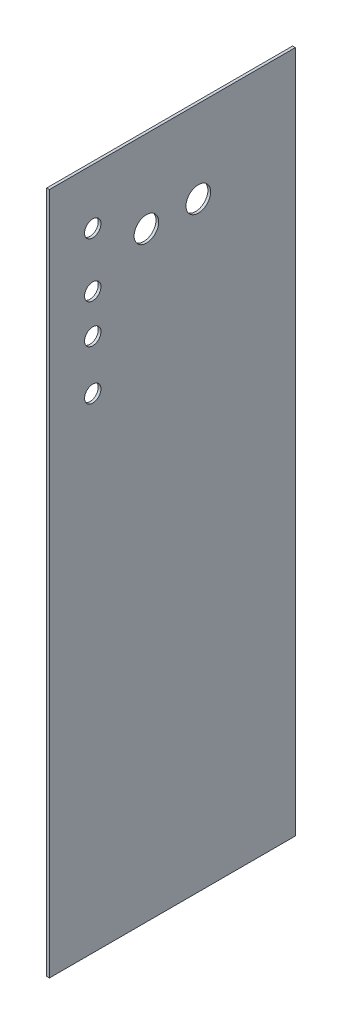
ISO-10303-21;
HEADER;
FILE_DESCRIPTION(('STEP AP214'),'2;1');
FILE_NAME('part.step','',(''),(''),'','','');
FILE_SCHEMA(('AUTOMOTIVE_DESIGN { 1 0 10303 214 1 1 1 1 }'));
ENDSEC;
DATA;
#1=APPLICATION_CONTEXT('core data for automotive mechanical design processes');
#2=APPLICATION_PROTOCOL_DEFINITION('international standard','automotive_design',2000,#1);
#3=PRODUCT_CONTEXT('',#1,'mechanical');
#4=PRODUCT('Part','Part','',(#3));
#5=PRODUCT_RELATED_PRODUCT_CATEGORY('part','',(#4));
#6=PRODUCT_DEFINITION_FORMATION('','',#4);
#7=PRODUCT_DEFINITION_CONTEXT('part definition',#1,'design');
#8=PRODUCT_DEFINITION('design','',#6,#7);
#9=PRODUCT_DEFINITION_SHAPE('','',#8);
#10=(LENGTH_UNIT() NAMED_UNIT(*) SI_UNIT(.MILLI.,.METRE.));
#11=(NAMED_UNIT(*) PLANE_ANGLE_UNIT() SI_UNIT($,.RADIAN.));
#12=(NAMED_UNIT(*) SI_UNIT($,.STERADIAN.) SOLID_ANGLE_UNIT());
#13=UNCERTAINTY_MEASURE_WITH_UNIT(LENGTH_MEASURE(1.E-05),#10,'distance_accuracy_value','');
#14=(GEOMETRIC_REPRESENTATION_CONTEXT(3) GLOBAL_UNCERTAINTY_ASSIGNED_CONTEXT((#13)) GLOBAL_UNIT_ASSIGNED_CONTEXT((#10,
#11,#12)) REPRESENTATION_CONTEXT('',''));
#15=CARTESIAN_POINT('',(0.,0.,0.));
#16=DIRECTION('',(0.,0.,1.));
#17=DIRECTION('',(1.,0.,0.));
#18=AXIS2_PLACEMENT_3D('',#15,#16,#17);
#19=CARTESIAN_POINT('',(-248.,250.,-133.832293437024));
#20=DIRECTION('',(1.,0.,0.));
#21=DIRECTION('',(0.,0.,-1.));
#22=AXIS2_PLACEMENT_3D('',#19,#20,#21);
#23=PLANE('',#22);
#24=DIRECTION('',(0.,0.,1.));
#25=VECTOR('',#24,1.);
#26=CARTESIAN_POINT('',(-248.,-250.,0.));
#27=LINE('',#26,#25);
#28=CARTESIAN_POINT('',(-248.,-250.,-90.));
#29=VERTEX_POINT('',#28);
#30=CARTESIAN_POINT('',(-248.,-250.,90.));
#31=VERTEX_POINT('',#30);
#32=EDGE_CURVE('E38',#29,#31,#27,.T.);
#33=ORIENTED_EDGE('',*,*,#32,.F.);
#34=DIRECTION('',(0.,1.,0.));
#35=VECTOR('',#34,1.);
#36=CARTESIAN_POINT('',(-248.,250.,-90.));
#37=LINE('',#36,#35);
#38=CARTESIAN_POINT('',(-248.,250.,-90.));
#39=VERTEX_POINT('',#38);
#40=EDGE_CURVE('E82',#29,#39,#37,.T.);
#41=ORIENTED_EDGE('',*,*,#40,.T.);
#42=DIRECTION('',(0.,0.,1.));
#43=VECTOR('',#42,1.);
#44=CARTESIAN_POINT('',(-248.,250.,0.));
#45=LINE('',#44,#43);
#46=CARTESIAN_POINT('',(-248.,250.,90.));
#47=VERTEX_POINT('',#46);
#48=EDGE_CURVE('E90',#39,#47,#45,.T.);
#49=ORIENTED_EDGE('',*,*,#48,.T.);
#50=DIRECTION('',(0.,-1.,0.));
#51=VECTOR('',#50,1.);
#52=CARTESIAN_POINT('',(-248.,250.,90.));
#53=LINE('',#52,#51);
#54=EDGE_CURVE('E91',#47,#31,#53,.T.);
#55=ORIENTED_EDGE('',*,*,#54,.T.);
#56=EDGE_LOOP('',(#33,#41,#49,#55));
#57=FACE_BOUND('',#56,.T.);
#58=CARTESIAN_POINT('',(-248.,104.725874497319,58.2924610892519));
#59=DIRECTION('',(-1.,0.,0.));
#60=DIRECTION('',(0.,0.,1.));
#61=AXIS2_PLACEMENT_3D('',#58,#59,#60);
#62=CIRCLE('',#61,6.);
#63=CARTESIAN_POINT('',(-248.,104.725874497319,64.2924610892519));
#64=VERTEX_POINT('',#63);
#65=EDGE_CURVE('E44',#64,#64,#62,.T.);
#66=ORIENTED_EDGE('',*,*,#65,.T.);
#67=EDGE_LOOP('',(#66));
#68=FACE_BOUND('',#67,.T.);
#69=CARTESIAN_POINT('',(-248.,141.058142849317,58.2924610892519));
#70=DIRECTION('',(-1.,0.,0.));
#71=DIRECTION('',(0.,0.,1.));
#72=AXIS2_PLACEMENT_3D('',#69,#70,#71);
#73=CIRCLE('',#72,6.);
#74=CARTESIAN_POINT('',(-248.,141.058142849317,64.2924610892519));
#75=VERTEX_POINT('',#74);
#76=EDGE_CURVE('E125',#75,#75,#73,.T.);
#77=ORIENTED_EDGE('',*,*,#76,.T.);
#78=EDGE_LOOP('',(#77));
#79=FACE_BOUND('',#78,.T.);
#80=CARTESIAN_POINT('',(-248.,169.584531844066,58.2924610892519));
#81=DIRECTION('',(-1.,0.,0.));
#82=DIRECTION('',(0.,0.,1.));
#83=AXIS2_PLACEMENT_3D('',#80,#81,#82);
#84=CIRCLE('',#83,6.);
#85=CARTESIAN_POINT('',(-248.,169.584531844066,64.2924610892519));
#86=VERTEX_POINT('',#85);
#87=EDGE_CURVE('E119',#86,#86,#84,.T.);
#88=ORIENTED_EDGE('',*,*,#87,.T.);
#89=EDGE_LOOP('',(#88));
#90=FACE_BOUND('',#89,.T.);
#91=CARTESIAN_POINT('',(-248.,209.512605417491,58.2924610892519));
#92=DIRECTION('',(-1.,0.,0.));
#93=DIRECTION('',(0.,0.,1.));
#94=AXIS2_PLACEMENT_3D('',#91,#92,#93);
#95=CIRCLE('',#94,6.);
#96=CARTESIAN_POINT('',(-248.,209.512605417491,64.2924610892519));
#97=VERTEX_POINT('',#96);
#98=EDGE_CURVE('E113',#97,#97,#95,.T.);
#99=ORIENTED_EDGE('',*,*,#98,.T.);
#100=EDGE_LOOP('',(#99));
#101=FACE_BOUND('',#100,.T.);
#102=CARTESIAN_POINT('',(-248.,189.512605417491,-19.));
#103=DIRECTION('',(-1.,0.,0.));
#104=DIRECTION('',(0.,0.,-1.));
#105=AXIS2_PLACEMENT_3D('',#102,#103,#104);
#106=CIRCLE('',#105,9.00000000000001);
#107=CARTESIAN_POINT('',(-248.,189.512605417491,-28.));
#108=VERTEX_POINT('',#107);
#109=EDGE_CURVE('E106',#108,#108,#106,.T.);
#110=ORIENTED_EDGE('',*,*,#109,.T.);
#111=EDGE_LOOP('',(#110));
#112=FACE_BOUND('',#111,.T.);
#113=CARTESIAN_POINT('',(-248.,189.512605417491,19.));
#114=DIRECTION('',(-1.,0.,0.));
#115=DIRECTION('',(0.,0.,1.));
#116=AXIS2_PLACEMENT_3D('',#113,#114,#115);
#117=CIRCLE('',#116,9.00000000000001);
#118=CARTESIAN_POINT('',(-248.,189.512605417491,28.));
#119=VERTEX_POINT('',#118);
#120=EDGE_CURVE('E105',#119,#119,#117,.T.);
#121=ORIENTED_EDGE('',*,*,#120,.T.);
#122=EDGE_LOOP('',(#121));
#123=FACE_BOUND('',#122,.T.);
#124=ADVANCED_FACE('F34',(#57,#68,#79,#90,#101,#112,#123),#23,.T.);
#125=CARTESIAN_POINT('',(-250.,250.,90.));
#126=DIRECTION('',(1.,0.,0.));
#127=DIRECTION('',(0.,0.,-1.));
#128=AXIS2_PLACEMENT_3D('',#125,#126,#127);
#129=PLANE('',#128);
#130=CARTESIAN_POINT('',(-250.,104.725874497319,58.2924610892519));
#131=DIRECTION('',(-1.,0.,0.));
#132=DIRECTION('',(0.,0.,1.));
#133=AXIS2_PLACEMENT_3D('',#130,#131,#132);
#134=CIRCLE('',#133,6.);
#135=CARTESIAN_POINT('',(-250.,104.725874497319,64.2924610892519));
#136=VERTEX_POINT('',#135);
#137=EDGE_CURVE('E11',#136,#136,#134,.T.);
#138=ORIENTED_EDGE('',*,*,#137,.F.);
#139=EDGE_LOOP('',(#138));
#140=FACE_BOUND('',#139,.T.);
#141=CARTESIAN_POINT('',(-250.,141.058142849317,58.2924610892519));
#142=DIRECTION('',(-1.,0.,0.));
#143=DIRECTION('',(0.,0.,1.));
#144=AXIS2_PLACEMENT_3D('',#141,#142,#143);
#145=CIRCLE('',#144,6.);
#146=CARTESIAN_POINT('',(-250.,141.058142849317,64.2924610892519));
#147=VERTEX_POINT('',#146);
#148=EDGE_CURVE('E128',#147,#147,#145,.T.);
#149=ORIENTED_EDGE('',*,*,#148,.F.);
#150=EDGE_LOOP('',(#149));
#151=FACE_BOUND('',#150,.T.);
#152=CARTESIAN_POINT('',(-250.,169.584531844066,58.2924610892519));
#153=DIRECTION('',(-1.,0.,0.));
#154=DIRECTION('',(0.,0.,1.));
#155=AXIS2_PLACEMENT_3D('',#152,#153,#154);
#156=CIRCLE('',#155,6.);
#157=CARTESIAN_POINT('',(-250.,169.584531844066,64.2924610892519));
#158=VERTEX_POINT('',#157);
#159=EDGE_CURVE('E122',#158,#158,#156,.T.);
#160=ORIENTED_EDGE('',*,*,#159,.F.);
#161=EDGE_LOOP('',(#160));
#162=FACE_BOUND('',#161,.T.);
#163=CARTESIAN_POINT('',(-250.,209.512605417491,58.2924610892519));
#164=DIRECTION('',(-1.,0.,0.));
#165=DIRECTION('',(0.,0.,1.));
#166=AXIS2_PLACEMENT_3D('',#163,#164,#165);
#167=CIRCLE('',#166,6.);
#168=CARTESIAN_POINT('',(-250.,209.512605417491,64.2924610892519));
#169=VERTEX_POINT('',#168);
#170=EDGE_CURVE('E116',#169,#169,#167,.T.);
#171=ORIENTED_EDGE('',*,*,#170,.F.);
#172=EDGE_LOOP('',(#171));
#173=FACE_BOUND('',#172,.T.);
#174=CARTESIAN_POINT('',(-250.,189.512605417491,-19.));
#175=DIRECTION('',(-1.,0.,0.));
#176=DIRECTION('',(0.,0.,-1.));
#177=AXIS2_PLACEMENT_3D('',#174,#175,#176);
#178=CIRCLE('',#177,9.00000000000001);
#179=CARTESIAN_POINT('',(-250.,189.512605417491,-28.));
#180=VERTEX_POINT('',#179);
#181=EDGE_CURVE('E109',#180,#180,#178,.T.);
#182=ORIENTED_EDGE('',*,*,#181,.F.);
#183=EDGE_LOOP('',(#182));
#184=FACE_BOUND('',#183,.T.);
#185=CARTESIAN_POINT('',(-250.,189.512605417491,19.));
#186=DIRECTION('',(-1.,0.,0.));
#187=DIRECTION('',(0.,0.,1.));
#188=AXIS2_PLACEMENT_3D('',#185,#186,#187);
#189=CIRCLE('',#188,9.00000000000001);
#190=CARTESIAN_POINT('',(-250.,189.512605417491,28.));
#191=VERTEX_POINT('',#190);
#192=EDGE_CURVE('E110',#191,#191,#189,.T.);
#193=ORIENTED_EDGE('',*,*,#192,.F.);
#194=EDGE_LOOP('',(#193));
#195=FACE_BOUND('',#194,.T.);
#196=DIRECTION('',(0.,0.,1.));
#197=VECTOR('',#196,1.);
#198=CARTESIAN_POINT('',(-250.,-250.,90.));
#199=LINE('',#198,#197);
#200=CARTESIAN_POINT('',(-250.,-250.,-90.));
#201=VERTEX_POINT('',#200);
#202=CARTESIAN_POINT('',(-250.,-250.,90.));
#203=VERTEX_POINT('',#202);
#204=EDGE_CURVE('E103',#201,#203,#199,.T.);
#205=ORIENTED_EDGE('',*,*,#204,.T.);
#206=DIRECTION('',(0.,-1.,0.));
#207=VECTOR('',#206,1.);
#208=CARTESIAN_POINT('',(-250.,250.,90.));
#209=LINE('',#208,#207);
#210=CARTESIAN_POINT('',(-250.,250.,90.));
#211=VERTEX_POINT('',#210);
#212=EDGE_CURVE('E99',#211,#203,#209,.T.);
#213=ORIENTED_EDGE('',*,*,#212,.F.);
#214=DIRECTION('',(0.,0.,1.));
#215=VECTOR('',#214,1.);
#216=CARTESIAN_POINT('',(-250.,250.,90.));
#217=LINE('',#216,#215);
#218=CARTESIAN_POINT('',(-250.,250.,-90.));
#219=VERTEX_POINT('',#218);
#220=EDGE_CURVE('E65',#219,#211,#217,.T.);
#221=ORIENTED_EDGE('',*,*,#220,.F.);
#222=DIRECTION('',(0.,-1.,0.));
#223=VECTOR('',#222,1.);
#224=CARTESIAN_POINT('',(-250.,250.,-90.));
#225=LINE('',#224,#223);
#226=EDGE_CURVE('E83',#219,#201,#225,.T.);
#227=ORIENTED_EDGE('',*,*,#226,.T.);
#228=EDGE_LOOP('',(#205,#213,#221,#227));
#229=FACE_BOUND('',#228,.T.);
#230=ADVANCED_FACE('F146',(#140,#151,#162,#173,#184,#195,#229),#129,.F.);
#231=CARTESIAN_POINT('',(-248.,104.725874497319,58.2924610892519));
#232=DIRECTION('',(-1.,0.,0.));
#233=DIRECTION('',(0.,0.,1.));
#234=AXIS2_PLACEMENT_3D('',#231,#232,#233);
#235=CYLINDRICAL_SURFACE('',#234,6.);
#236=ORIENTED_EDGE('',*,*,#65,.F.);
#237=EDGE_LOOP('',(#236));
#238=FACE_BOUND('',#237,.T.);
#239=ORIENTED_EDGE('',*,*,#137,.T.);
#240=EDGE_LOOP('',(#239));
#241=FACE_BOUND('',#240,.T.);
#242=ADVANCED_FACE('F161',(#238,#241),#235,.F.);
#243=CARTESIAN_POINT('',(-248.,141.058142849317,58.2924610892519));
#244=DIRECTION('',(-1.,0.,0.));
#245=DIRECTION('',(0.,0.,1.));
#246=AXIS2_PLACEMENT_3D('',#243,#244,#245);
#247=CYLINDRICAL_SURFACE('',#246,6.);
#248=ORIENTED_EDGE('',*,*,#76,.F.);
#249=EDGE_LOOP('',(#248));
#250=FACE_BOUND('',#249,.T.);
#251=ORIENTED_EDGE('',*,*,#148,.T.);
#252=EDGE_LOOP('',(#251));
#253=FACE_BOUND('',#252,.T.);
#254=ADVANCED_FACE('F168',(#250,#253),#247,.F.);
#255=CARTESIAN_POINT('',(-248.,169.584531844066,58.2924610892519));
#256=DIRECTION('',(-1.,0.,0.));
#257=DIRECTION('',(0.,0.,1.));
#258=AXIS2_PLACEMENT_3D('',#255,#256,#257);
#259=CYLINDRICAL_SURFACE('',#258,6.);
#260=ORIENTED_EDGE('',*,*,#87,.F.);
#261=EDGE_LOOP('',(#260));
#262=FACE_BOUND('',#261,.T.);
#263=ORIENTED_EDGE('',*,*,#159,.T.);
#264=EDGE_LOOP('',(#263));
#265=FACE_BOUND('',#264,.T.);
#266=ADVANCED_FACE('F177',(#262,#265),#259,.F.);
#267=CARTESIAN_POINT('',(-248.,209.512605417491,58.2924610892519));
#268=DIRECTION('',(-1.,0.,0.));
#269=DIRECTION('',(0.,0.,1.));
#270=AXIS2_PLACEMENT_3D('',#267,#268,#269);
#271=CYLINDRICAL_SURFACE('',#270,6.);
#272=ORIENTED_EDGE('',*,*,#98,.F.);
#273=EDGE_LOOP('',(#272));
#274=FACE_BOUND('',#273,.T.);
#275=ORIENTED_EDGE('',*,*,#170,.T.);
#276=EDGE_LOOP('',(#275));
#277=FACE_BOUND('',#276,.T.);
#278=ADVANCED_FACE('F181',(#274,#277),#271,.F.);
#279=CARTESIAN_POINT('',(-248.,189.512605417491,-19.));
#280=DIRECTION('',(-1.,0.,0.));
#281=DIRECTION('',(0.,0.,1.));
#282=AXIS2_PLACEMENT_3D('',#279,#280,#281);
#283=CYLINDRICAL_SURFACE('',#282,9.00000000000001);
#284=ORIENTED_EDGE('',*,*,#109,.F.);
#285=EDGE_LOOP('',(#284));
#286=FACE_BOUND('',#285,.T.);
#287=ORIENTED_EDGE('',*,*,#181,.T.);
#288=EDGE_LOOP('',(#287));
#289=FACE_BOUND('',#288,.T.);
#290=ADVANCED_FACE('F157',(#286,#289),#283,.F.);
#291=CARTESIAN_POINT('',(-248.,189.512605417491,19.));
#292=DIRECTION('',(-1.,0.,0.));
#293=DIRECTION('',(0.,0.,1.));
#294=AXIS2_PLACEMENT_3D('',#291,#292,#293);
#295=CYLINDRICAL_SURFACE('',#294,9.00000000000001);
#296=ORIENTED_EDGE('',*,*,#120,.F.);
#297=EDGE_LOOP('',(#296));
#298=FACE_BOUND('',#297,.T.);
#299=ORIENTED_EDGE('',*,*,#192,.T.);
#300=EDGE_LOOP('',(#299));
#301=FACE_BOUND('',#300,.T.);
#302=ADVANCED_FACE('F150',(#298,#301),#295,.F.);
#303=CARTESIAN_POINT('',(-250.,250.,90.));
#304=DIRECTION('',(0.,0.,-1.));
#305=DIRECTION('',(-1.,0.,0.));
#306=AXIS2_PLACEMENT_3D('',#303,#304,#305);
#307=PLANE('',#306);
#308=ORIENTED_EDGE('',*,*,#54,.F.);
#309=DIRECTION('',(1.,0.,0.));
#310=VECTOR('',#309,1.);
#311=CARTESIAN_POINT('',(-250.,250.,90.));
#312=LINE('',#311,#310);
#313=EDGE_CURVE('E94',#211,#47,#312,.T.);
#314=ORIENTED_EDGE('',*,*,#313,.F.);
#315=ORIENTED_EDGE('',*,*,#212,.T.);
#316=DIRECTION('',(1.,0.,0.));
#317=VECTOR('',#316,1.);
#318=CARTESIAN_POINT('',(-250.,-250.,90.));
#319=LINE('',#318,#317);
#320=EDGE_CURVE('E85',#203,#31,#319,.T.);
#321=ORIENTED_EDGE('',*,*,#320,.T.);
#322=EDGE_LOOP('',(#308,#314,#315,#321));
#323=FACE_BOUND('',#322,.T.);
#324=ADVANCED_FACE('F148',(#323),#307,.F.);
#325=CARTESIAN_POINT('',(-250.,250.,-90.));
#326=DIRECTION('',(0.,0.,1.));
#327=DIRECTION('',(1.,0.,0.));
#328=AXIS2_PLACEMENT_3D('',#325,#326,#327);
#329=PLANE('',#328);
#330=ORIENTED_EDGE('',*,*,#40,.F.);
#331=DIRECTION('',(-1.,0.,0.));
#332=VECTOR('',#331,1.);
#333=CARTESIAN_POINT('',(-250.,-250.,-90.));
#334=LINE('',#333,#332);
#335=EDGE_CURVE('E53',#29,#201,#334,.T.);
#336=ORIENTED_EDGE('',*,*,#335,.T.);
#337=ORIENTED_EDGE('',*,*,#226,.F.);
#338=DIRECTION('',(-1.,0.,0.));
#339=VECTOR('',#338,1.);
#340=CARTESIAN_POINT('',(-250.,250.,-90.));
#341=LINE('',#340,#339);
#342=EDGE_CURVE('E79',#39,#219,#341,.T.);
#343=ORIENTED_EDGE('',*,*,#342,.F.);
#344=EDGE_LOOP('',(#330,#336,#337,#343));
#345=FACE_BOUND('',#344,.T.);
#346=ADVANCED_FACE('F81',(#345),#329,.F.);
#347=CARTESIAN_POINT('',(0.,-250.,0.));
#348=DIRECTION('',(0.,-1.,0.));
#349=DIRECTION('',(0.,0.,-1.));
#350=AXIS2_PLACEMENT_3D('',#347,#348,#349);
#351=PLANE('',#350);
#352=ORIENTED_EDGE('',*,*,#335,.F.);
#353=ORIENTED_EDGE('',*,*,#32,.T.);
#354=ORIENTED_EDGE('',*,*,#320,.F.);
#355=ORIENTED_EDGE('',*,*,#204,.F.);
#356=EDGE_LOOP('',(#352,#353,#354,#355));
#357=FACE_BOUND('',#356,.T.);
#358=ADVANCED_FACE('F36',(#357),#351,.T.);
#359=CARTESIAN_POINT('',(0.,250.,0.));
#360=DIRECTION('',(0.,-1.,0.));
#361=DIRECTION('',(0.,0.,-1.));
#362=AXIS2_PLACEMENT_3D('',#359,#360,#361);
#363=PLANE('',#362);
#364=ORIENTED_EDGE('',*,*,#48,.F.);
#365=ORIENTED_EDGE('',*,*,#342,.T.);
#366=ORIENTED_EDGE('',*,*,#220,.T.);
#367=ORIENTED_EDGE('',*,*,#313,.T.);
#368=EDGE_LOOP('',(#364,#365,#366,#367));
#369=FACE_BOUND('',#368,.T.);
#370=ADVANCED_FACE('F92',(#369),#363,.F.);
#371=CLOSED_SHELL('',(#124,#230,#242,#254,#266,#278,#290,#302,#324,#346,#358,#370));
#372=MANIFOLD_SOLID_BREP('B2',#371);
#373=ADVANCED_BREP_SHAPE_REPRESENTATION('',(#18,#372),#14);
#374=SHAPE_DEFINITION_REPRESENTATION(#9,#373);
ENDSEC;
END-ISO-10303-21;
